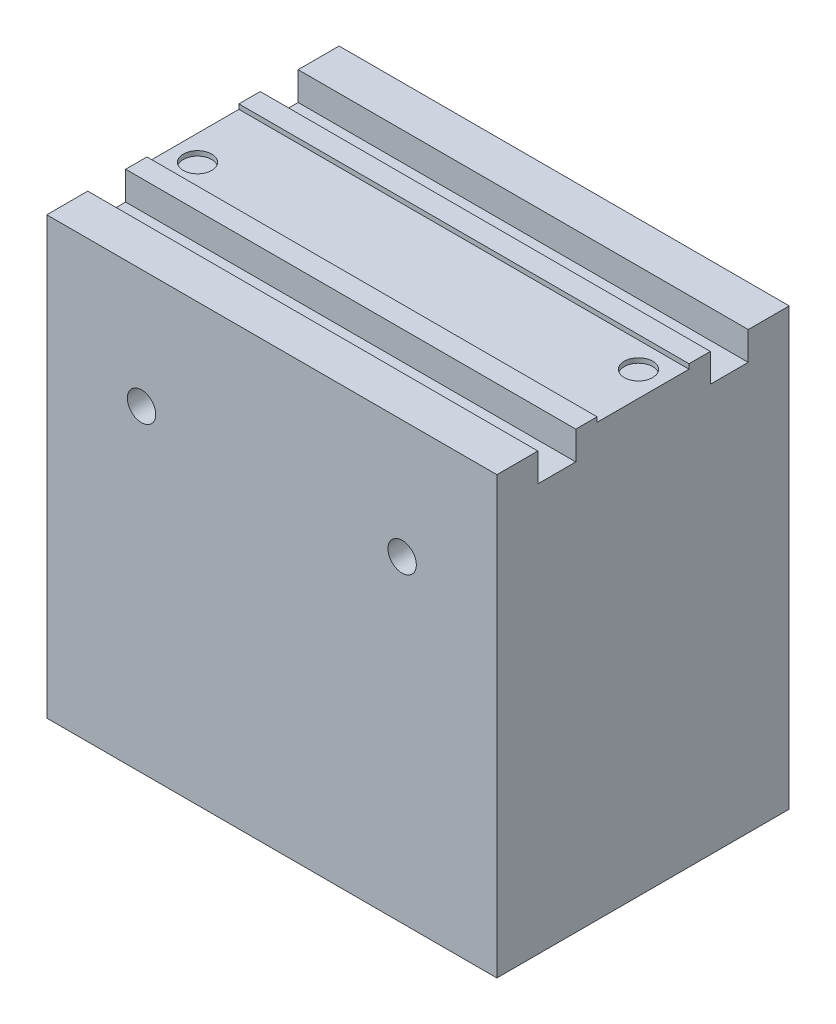
ISO-10303-21;
HEADER;
FILE_DESCRIPTION(('STEP AP214'),'2;1');
FILE_NAME('part.step','',(''),(''),'','','');
FILE_SCHEMA(('AUTOMOTIVE_DESIGN { 1 0 10303 214 1 1 1 1 }'));
ENDSEC;
DATA;
#1=APPLICATION_CONTEXT('core data for automotive mechanical design processes');
#2=APPLICATION_PROTOCOL_DEFINITION('international standard','automotive_design',2000,#1);
#3=PRODUCT_CONTEXT('',#1,'mechanical');
#4=PRODUCT('Part','Part','',(#3));
#5=PRODUCT_RELATED_PRODUCT_CATEGORY('part','',(#4));
#6=PRODUCT_DEFINITION_FORMATION('','',#4);
#7=PRODUCT_DEFINITION_CONTEXT('part definition',#1,'design');
#8=PRODUCT_DEFINITION('design','',#6,#7);
#9=PRODUCT_DEFINITION_SHAPE('','',#8);
#10=(LENGTH_UNIT() NAMED_UNIT(*) SI_UNIT(.MILLI.,.METRE.));
#11=(NAMED_UNIT(*) PLANE_ANGLE_UNIT() SI_UNIT($,.RADIAN.));
#12=(NAMED_UNIT(*) SI_UNIT($,.STERADIAN.) SOLID_ANGLE_UNIT());
#13=UNCERTAINTY_MEASURE_WITH_UNIT(LENGTH_MEASURE(1.E-05),#10,'distance_accuracy_value','');
#14=(GEOMETRIC_REPRESENTATION_CONTEXT(3) GLOBAL_UNCERTAINTY_ASSIGNED_CONTEXT((#13)) GLOBAL_UNIT_ASSIGNED_CONTEXT((#10,
#11,#12)) REPRESENTATION_CONTEXT('',''));
#15=CARTESIAN_POINT('',(0.,0.,0.));
#16=DIRECTION('',(0.,0.,1.));
#17=DIRECTION('',(1.,0.,0.));
#18=AXIS2_PLACEMENT_3D('',#15,#16,#17);
#19=CARTESIAN_POINT('',(0.,92.,0.));
#20=DIRECTION('',(0.,1.,0.));
#21=DIRECTION('',(0.,0.,1.));
#22=AXIS2_PLACEMENT_3D('',#19,#20,#21);
#23=PLANE('',#22);
#24=DIRECTION('',(-1.,0.,0.));
#25=VECTOR('',#24,1.);
#26=CARTESIAN_POINT('',(-47.5,92.,-22.2));
#27=LINE('',#26,#25);
#28=CARTESIAN_POINT('',(47.5,92.,-22.2));
#29=VERTEX_POINT('',#28);
#30=CARTESIAN_POINT('',(-47.5,92.,-22.2));
#31=VERTEX_POINT('',#30);
#32=EDGE_CURVE('E215',#29,#31,#27,.T.);
#33=ORIENTED_EDGE('',*,*,#32,.F.);
#34=DIRECTION('',(0.,0.,-1.));
#35=VECTOR('',#34,1.);
#36=CARTESIAN_POINT('',(47.5,92.,30.85));
#37=LINE('',#36,#35);
#38=CARTESIAN_POINT('',(47.5,92.,-30.85));
#39=VERTEX_POINT('',#38);
#40=EDGE_CURVE('E250',#29,#39,#37,.T.);
#41=ORIENTED_EDGE('',*,*,#40,.T.);
#42=DIRECTION('',(-1.,0.,0.));
#43=VECTOR('',#42,1.);
#44=CARTESIAN_POINT('',(-47.5,92.,-30.85));
#45=LINE('',#44,#43);
#46=CARTESIAN_POINT('',(-47.5,92.,-30.85));
#47=VERTEX_POINT('',#46);
#48=EDGE_CURVE('E252',#39,#47,#45,.T.);
#49=ORIENTED_EDGE('',*,*,#48,.T.);
#50=DIRECTION('',(0.,0.,1.));
#51=VECTOR('',#50,1.);
#52=CARTESIAN_POINT('',(-47.5,92.,30.85));
#53=LINE('',#52,#51);
#54=EDGE_CURVE('E246',#47,#31,#53,.T.);
#55=ORIENTED_EDGE('',*,*,#54,.T.);
#56=EDGE_LOOP('',(#33,#41,#49,#55));
#57=FACE_BOUND('',#56,.T.);
#58=ADVANCED_FACE('F36',(#57),#23,.T.);
#59=DIRECTION('',(-1.,0.,0.));
#60=VECTOR('',#59,1.);
#61=CARTESIAN_POINT('',(-47.5,92.,14.2));
#62=LINE('',#61,#60);
#63=CARTESIAN_POINT('',(47.5,92.,14.2));
#64=VERTEX_POINT('',#63);
#65=CARTESIAN_POINT('',(-47.5,92.,14.2));
#66=VERTEX_POINT('',#65);
#67=EDGE_CURVE('E190',#64,#66,#62,.T.);
#68=ORIENTED_EDGE('',*,*,#67,.F.);
#69=CARTESIAN_POINT('',(47.5,92.,9.7));
#70=VERTEX_POINT('',#69);
#71=EDGE_CURVE('E244',#64,#70,#37,.T.);
#72=ORIENTED_EDGE('',*,*,#71,.T.);
#73=DIRECTION('',(1.,0.,0.));
#74=VECTOR('',#73,1.);
#75=CARTESIAN_POINT('',(-47.5,92.,9.7));
#76=LINE('',#75,#74);
#77=CARTESIAN_POINT('',(-47.5,92.,9.7));
#78=VERTEX_POINT('',#77);
#79=EDGE_CURVE('E240',#78,#70,#76,.T.);
#80=ORIENTED_EDGE('',*,*,#79,.F.);
#81=EDGE_CURVE('E175',#78,#66,#53,.T.);
#82=ORIENTED_EDGE('',*,*,#81,.T.);
#83=EDGE_LOOP('',(#68,#72,#80,#82));
#84=FACE_BOUND('',#83,.T.);
#85=ADVANCED_FACE('F371',(#84),#23,.T.);
#86=CARTESIAN_POINT('',(47.5,93.,30.85));
#87=DIRECTION('',(-1.,0.,0.));
#88=DIRECTION('',(0.,0.,1.));
#89=AXIS2_PLACEMENT_3D('',#86,#87,#88);
#90=PLANE('',#89);
#91=CARTESIAN_POINT('',(47.5,92.,-9.7));
#92=VERTEX_POINT('',#91);
#93=CARTESIAN_POINT('',(47.5,92.,-14.2));
#94=VERTEX_POINT('',#93);
#95=EDGE_CURVE('E251',#92,#94,#37,.T.);
#96=ORIENTED_EDGE('',*,*,#95,.F.);
#97=DIRECTION('',(0.,1.,0.));
#98=VECTOR('',#97,1.);
#99=CARTESIAN_POINT('',(47.5,91.,-9.7));
#100=LINE('',#99,#98);
#101=CARTESIAN_POINT('',(47.5,91.,-9.7));
#102=VERTEX_POINT('',#101);
#103=EDGE_CURVE('E177',#102,#92,#100,.T.);
#104=ORIENTED_EDGE('',*,*,#103,.F.);
#105=DIRECTION('',(0.,0.,-1.));
#106=VECTOR('',#105,1.);
#107=CARTESIAN_POINT('',(47.5,91.,9.7));
#108=LINE('',#107,#106);
#109=CARTESIAN_POINT('',(47.5,91.,9.7));
#110=VERTEX_POINT('',#109);
#111=EDGE_CURVE('E158',#110,#102,#108,.T.);
#112=ORIENTED_EDGE('',*,*,#111,.F.);
#113=DIRECTION('',(0.,1.,0.));
#114=VECTOR('',#113,1.);
#115=CARTESIAN_POINT('',(47.5,91.,9.7));
#116=LINE('',#115,#114);
#117=EDGE_CURVE('E155',#110,#70,#116,.T.);
#118=ORIENTED_EDGE('',*,*,#117,.T.);
#119=ORIENTED_EDGE('',*,*,#71,.F.);
#120=DIRECTION('',(0.,1.,0.));
#121=VECTOR('',#120,1.);
#122=CARTESIAN_POINT('',(47.5,86.,14.2));
#123=LINE('',#122,#121);
#124=CARTESIAN_POINT('',(47.5,86.,14.2));
#125=VERTEX_POINT('',#124);
#126=EDGE_CURVE('E205',#125,#64,#123,.T.);
#127=ORIENTED_EDGE('',*,*,#126,.F.);
#128=DIRECTION('',(0.,0.,-1.));
#129=VECTOR('',#128,1.);
#130=CARTESIAN_POINT('',(47.5,86.,22.2));
#131=LINE('',#130,#129);
#132=CARTESIAN_POINT('',(47.5,86.,22.2));
#133=VERTEX_POINT('',#132);
#134=EDGE_CURVE('E193',#133,#125,#131,.T.);
#135=ORIENTED_EDGE('',*,*,#134,.F.);
#136=DIRECTION('',(0.,1.,0.));
#137=VECTOR('',#136,1.);
#138=CARTESIAN_POINT('',(47.5,86.,22.2));
#139=LINE('',#138,#137);
#140=CARTESIAN_POINT('',(47.5,92.,22.2));
#141=VERTEX_POINT('',#140);
#142=EDGE_CURVE('E207',#133,#141,#139,.T.);
#143=ORIENTED_EDGE('',*,*,#142,.T.);
#144=CARTESIAN_POINT('',(47.5,92.,30.85));
#145=VERTEX_POINT('',#144);
#146=EDGE_CURVE('E247',#145,#141,#37,.T.);
#147=ORIENTED_EDGE('',*,*,#146,.F.);
#148=DIRECTION('',(0.,-1.,0.));
#149=VECTOR('',#148,1.);
#150=CARTESIAN_POINT('',(47.5,93.,30.85));
#151=LINE('',#150,#149);
#152=CARTESIAN_POINT('',(47.5,0.,30.85));
#153=VERTEX_POINT('',#152);
#154=EDGE_CURVE('E266',#145,#153,#151,.T.);
#155=ORIENTED_EDGE('',*,*,#154,.T.);
#156=DIRECTION('',(0.,0.,-1.));
#157=VECTOR('',#156,1.);
#158=CARTESIAN_POINT('',(47.5,0.,30.85));
#159=LINE('',#158,#157);
#160=CARTESIAN_POINT('',(47.5,0.,-30.85));
#161=VERTEX_POINT('',#160);
#162=EDGE_CURVE('E254',#153,#161,#159,.T.);
#163=ORIENTED_EDGE('',*,*,#162,.T.);
#164=DIRECTION('',(0.,-1.,0.));
#165=VECTOR('',#164,1.);
#166=CARTESIAN_POINT('',(47.5,93.,-30.85));
#167=LINE('',#166,#165);
#168=EDGE_CURVE('E45',#39,#161,#167,.T.);
#169=ORIENTED_EDGE('',*,*,#168,.F.);
#170=ORIENTED_EDGE('',*,*,#40,.F.);
#171=DIRECTION('',(0.,1.,0.));
#172=VECTOR('',#171,1.);
#173=CARTESIAN_POINT('',(47.5,86.,-22.2));
#174=LINE('',#173,#172);
#175=CARTESIAN_POINT('',(47.5,86.,-22.2));
#176=VERTEX_POINT('',#175);
#177=EDGE_CURVE('E227',#176,#29,#174,.T.);
#178=ORIENTED_EDGE('',*,*,#177,.F.);
#179=DIRECTION('',(0.,0.,-1.));
#180=VECTOR('',#179,1.);
#181=CARTESIAN_POINT('',(47.5,86.,-22.2));
#182=LINE('',#181,#180);
#183=CARTESIAN_POINT('',(47.5,86.,-14.2));
#184=VERTEX_POINT('',#183);
#185=EDGE_CURVE('E218',#184,#176,#182,.T.);
#186=ORIENTED_EDGE('',*,*,#185,.F.);
#187=DIRECTION('',(0.,1.,0.));
#188=VECTOR('',#187,1.);
#189=CARTESIAN_POINT('',(47.5,86.,-14.2));
#190=LINE('',#189,#188);
#191=EDGE_CURVE('E229',#184,#94,#190,.T.);
#192=ORIENTED_EDGE('',*,*,#191,.T.);
#193=EDGE_LOOP('',(#96,#104,#112,#118,#119,#127,#135,#143,#147,#155,#163,#169,#170,#178,#186,#192));
#194=FACE_BOUND('',#193,.T.);
#195=ADVANCED_FACE('F38',(#194),#90,.F.);
#196=CARTESIAN_POINT('',(-47.5,93.,-30.85));
#197=DIRECTION('',(0.,0.,1.));
#198=DIRECTION('',(1.,0.,0.));
#199=AXIS2_PLACEMENT_3D('',#196,#197,#198);
#200=PLANE('',#199);
#201=CARTESIAN_POINT('',(-27.5,66.9999999999999,-30.85));
#202=DIRECTION('',(0.,0.,1.));
#203=DIRECTION('',(1.,0.,0.));
#204=AXIS2_PLACEMENT_3D('',#201,#202,#203);
#205=CIRCLE('',#204,3.);
#206=CARTESIAN_POINT('',(-24.5,66.9999999999999,-30.85));
#207=VERTEX_POINT('',#206);
#208=EDGE_CURVE('E169',#207,#207,#205,.T.);
#209=ORIENTED_EDGE('',*,*,#208,.T.);
#210=EDGE_LOOP('',(#209));
#211=FACE_BOUND('',#210,.T.);
#212=CARTESIAN_POINT('',(27.5,66.9999999999999,-30.85));
#213=DIRECTION('',(0.,0.,1.));
#214=DIRECTION('',(-1.,0.,0.));
#215=AXIS2_PLACEMENT_3D('',#212,#213,#214);
#216=CIRCLE('',#215,3.00000000000001);
#217=CARTESIAN_POINT('',(24.5,66.9999999999999,-30.85));
#218=VERTEX_POINT('',#217);
#219=EDGE_CURVE('E335',#218,#218,#216,.T.);
#220=ORIENTED_EDGE('',*,*,#219,.T.);
#221=EDGE_LOOP('',(#220));
#222=FACE_BOUND('',#221,.T.);
#223=ORIENTED_EDGE('',*,*,#48,.F.);
#224=ORIENTED_EDGE('',*,*,#168,.T.);
#225=DIRECTION('',(-1.,0.,0.));
#226=VECTOR('',#225,1.);
#227=CARTESIAN_POINT('',(-47.5,0.,-30.85));
#228=LINE('',#227,#226);
#229=CARTESIAN_POINT('',(-47.5,0.,-30.85));
#230=VERTEX_POINT('',#229);
#231=EDGE_CURVE('E257',#161,#230,#228,.T.);
#232=ORIENTED_EDGE('',*,*,#231,.T.);
#233=DIRECTION('',(0.,-1.,0.));
#234=VECTOR('',#233,1.);
#235=CARTESIAN_POINT('',(-47.5,93.,-30.85));
#236=LINE('',#235,#234);
#237=EDGE_CURVE('E270',#47,#230,#236,.T.);
#238=ORIENTED_EDGE('',*,*,#237,.F.);
#239=EDGE_LOOP('',(#223,#224,#232,#238));
#240=FACE_BOUND('',#239,.T.);
#241=ADVANCED_FACE('F276',(#211,#222,#240),#200,.F.);
#242=CARTESIAN_POINT('',(-47.5,93.,30.85));
#243=DIRECTION('',(1.,0.,0.));
#244=DIRECTION('',(0.,0.,-1.));
#245=AXIS2_PLACEMENT_3D('',#242,#243,#244);
#246=PLANE('',#245);
#247=DIRECTION('',(0.,0.,1.));
#248=VECTOR('',#247,1.);
#249=CARTESIAN_POINT('',(-47.5,91.,-9.7));
#250=LINE('',#249,#248);
#251=CARTESIAN_POINT('',(-47.5,91.,-9.7));
#252=VERTEX_POINT('',#251);
#253=CARTESIAN_POINT('',(-47.5,91.,9.7));
#254=VERTEX_POINT('',#253);
#255=EDGE_CURVE('E159',#252,#254,#250,.T.);
#256=ORIENTED_EDGE('',*,*,#255,.F.);
#257=DIRECTION('',(0.,1.,0.));
#258=VECTOR('',#257,1.);
#259=CARTESIAN_POINT('',(-47.5,91.,-9.7));
#260=LINE('',#259,#258);
#261=CARTESIAN_POINT('',(-47.5,92.,-9.7));
#262=VERTEX_POINT('',#261);
#263=EDGE_CURVE('E322',#252,#262,#260,.T.);
#264=ORIENTED_EDGE('',*,*,#263,.T.);
#265=CARTESIAN_POINT('',(-47.5,92.,-14.2));
#266=VERTEX_POINT('',#265);
#267=EDGE_CURVE('E245',#266,#262,#53,.T.);
#268=ORIENTED_EDGE('',*,*,#267,.F.);
#269=DIRECTION('',(0.,1.,0.));
#270=VECTOR('',#269,1.);
#271=CARTESIAN_POINT('',(-47.5,86.,-14.2));
#272=LINE('',#271,#270);
#273=CARTESIAN_POINT('',(-47.5,86.,-14.2));
#274=VERTEX_POINT('',#273);
#275=EDGE_CURVE('E52',#274,#266,#272,.T.);
#276=ORIENTED_EDGE('',*,*,#275,.F.);
#277=DIRECTION('',(0.,0.,1.));
#278=VECTOR('',#277,1.);
#279=CARTESIAN_POINT('',(-47.5,86.,-22.2));
#280=LINE('',#279,#278);
#281=CARTESIAN_POINT('',(-47.5,86.,-22.2));
#282=VERTEX_POINT('',#281);
#283=EDGE_CURVE('E211',#282,#274,#280,.T.);
#284=ORIENTED_EDGE('',*,*,#283,.F.);
#285=DIRECTION('',(0.,1.,0.));
#286=VECTOR('',#285,1.);
#287=CARTESIAN_POINT('',(-47.5,86.,-22.2));
#288=LINE('',#287,#286);
#289=EDGE_CURVE('E200',#282,#31,#288,.T.);
#290=ORIENTED_EDGE('',*,*,#289,.T.);
#291=ORIENTED_EDGE('',*,*,#54,.F.);
#292=ORIENTED_EDGE('',*,*,#237,.T.);
#293=DIRECTION('',(0.,0.,1.));
#294=VECTOR('',#293,1.);
#295=CARTESIAN_POINT('',(-47.5,0.,30.85));
#296=LINE('',#295,#294);
#297=CARTESIAN_POINT('',(-47.5,0.,30.85));
#298=VERTEX_POINT('',#297);
#299=EDGE_CURVE('E260',#230,#298,#296,.T.);
#300=ORIENTED_EDGE('',*,*,#299,.T.);
#301=DIRECTION('',(0.,-1.,0.));
#302=VECTOR('',#301,1.);
#303=CARTESIAN_POINT('',(-47.5,93.,30.85));
#304=LINE('',#303,#302);
#305=CARTESIAN_POINT('',(-47.5,92.,30.85));
#306=VERTEX_POINT('',#305);
#307=EDGE_CURVE('E268',#306,#298,#304,.T.);
#308=ORIENTED_EDGE('',*,*,#307,.F.);
#309=CARTESIAN_POINT('',(-47.5,92.,22.2));
#310=VERTEX_POINT('',#309);
#311=EDGE_CURVE('E242',#310,#306,#53,.T.);
#312=ORIENTED_EDGE('',*,*,#311,.F.);
#313=DIRECTION('',(0.,1.,0.));
#314=VECTOR('',#313,1.);
#315=CARTESIAN_POINT('',(-47.5,86.,22.2));
#316=LINE('',#315,#314);
#317=CARTESIAN_POINT('',(-47.5,86.,22.2));
#318=VERTEX_POINT('',#317);
#319=EDGE_CURVE('E60',#318,#310,#316,.T.);
#320=ORIENTED_EDGE('',*,*,#319,.F.);
#321=DIRECTION('',(0.,0.,1.));
#322=VECTOR('',#321,1.);
#323=CARTESIAN_POINT('',(-47.5,86.,22.2));
#324=LINE('',#323,#322);
#325=CARTESIAN_POINT('',(-47.5,86.,14.2));
#326=VERTEX_POINT('',#325);
#327=EDGE_CURVE('E186',#326,#318,#324,.T.);
#328=ORIENTED_EDGE('',*,*,#327,.F.);
#329=DIRECTION('',(0.,1.,0.));
#330=VECTOR('',#329,1.);
#331=CARTESIAN_POINT('',(-47.5,86.,14.2));
#332=LINE('',#331,#330);
#333=EDGE_CURVE('E202',#326,#66,#332,.T.);
#334=ORIENTED_EDGE('',*,*,#333,.T.);
#335=ORIENTED_EDGE('',*,*,#81,.F.);
#336=DIRECTION('',(0.,1.,0.));
#337=VECTOR('',#336,1.);
#338=CARTESIAN_POINT('',(-47.5,91.,9.7));
#339=LINE('',#338,#337);
#340=EDGE_CURVE('E152',#254,#78,#339,.T.);
#341=ORIENTED_EDGE('',*,*,#340,.F.);
#342=EDGE_LOOP('',(#256,#264,#268,#276,#284,#290,#291,#292,#300,#308,#312,#320,#328,#334,#335,#341));
#343=FACE_BOUND('',#342,.T.);
#344=ADVANCED_FACE('F172',(#343),#246,.F.);
#345=CARTESIAN_POINT('',(-47.5,93.,30.85));
#346=DIRECTION('',(0.,0.,-1.));
#347=DIRECTION('',(-1.,0.,0.));
#348=AXIS2_PLACEMENT_3D('',#345,#346,#347);
#349=PLANE('',#348);
#350=CARTESIAN_POINT('',(-27.5,66.9999999999999,30.85));
#351=DIRECTION('',(0.,0.,1.));
#352=DIRECTION('',(1.,0.,0.));
#353=AXIS2_PLACEMENT_3D('',#350,#351,#352);
#354=CIRCLE('',#353,3.);
#355=CARTESIAN_POINT('',(-24.5,66.9999999999999,30.85));
#356=VERTEX_POINT('',#355);
#357=EDGE_CURVE('E338',#356,#356,#354,.T.);
#358=ORIENTED_EDGE('',*,*,#357,.F.);
#359=EDGE_LOOP('',(#358));
#360=FACE_BOUND('',#359,.T.);
#361=CARTESIAN_POINT('',(27.5,66.9999999999999,30.85));
#362=DIRECTION('',(0.,0.,1.));
#363=DIRECTION('',(-1.,0.,0.));
#364=AXIS2_PLACEMENT_3D('',#361,#362,#363);
#365=CIRCLE('',#364,3.00000000000001);
#366=CARTESIAN_POINT('',(24.5,66.9999999999999,30.85));
#367=VERTEX_POINT('',#366);
#368=EDGE_CURVE('E332',#367,#367,#365,.T.);
#369=ORIENTED_EDGE('',*,*,#368,.F.);
#370=EDGE_LOOP('',(#369));
#371=FACE_BOUND('',#370,.T.);
#372=DIRECTION('',(1.,0.,0.));
#373=VECTOR('',#372,1.);
#374=CARTESIAN_POINT('',(-47.5,92.,30.85));
#375=LINE('',#374,#373);
#376=EDGE_CURVE('E12',#306,#145,#375,.T.);
#377=ORIENTED_EDGE('',*,*,#376,.F.);
#378=ORIENTED_EDGE('',*,*,#307,.T.);
#379=DIRECTION('',(1.,0.,0.));
#380=VECTOR('',#379,1.);
#381=CARTESIAN_POINT('',(-47.5,0.,30.85));
#382=LINE('',#381,#380);
#383=EDGE_CURVE('E263',#298,#153,#382,.T.);
#384=ORIENTED_EDGE('',*,*,#383,.T.);
#385=ORIENTED_EDGE('',*,*,#154,.F.);
#386=EDGE_LOOP('',(#377,#378,#384,#385));
#387=FACE_BOUND('',#386,.T.);
#388=ADVANCED_FACE('F290',(#360,#371,#387),#349,.F.);
#389=CARTESIAN_POINT('',(0.,0.,0.));
#390=DIRECTION('',(0.,-1.,0.));
#391=DIRECTION('',(0.,0.,-1.));
#392=AXIS2_PLACEMENT_3D('',#389,#390,#391);
#393=PLANE('',#392);
#394=ORIENTED_EDGE('',*,*,#162,.F.);
#395=ORIENTED_EDGE('',*,*,#383,.F.);
#396=ORIENTED_EDGE('',*,*,#299,.F.);
#397=ORIENTED_EDGE('',*,*,#231,.F.);
#398=EDGE_LOOP('',(#394,#395,#396,#397));
#399=FACE_BOUND('',#398,.T.);
#400=ADVANCED_FACE('F283',(#399),#393,.T.);
#401=DIRECTION('',(1.,0.,0.));
#402=VECTOR('',#401,1.);
#403=CARTESIAN_POINT('',(-47.5,92.,-14.2));
#404=LINE('',#403,#402);
#405=EDGE_CURVE('E185',#266,#94,#404,.T.);
#406=ORIENTED_EDGE('',*,*,#405,.F.);
#407=ORIENTED_EDGE('',*,*,#267,.T.);
#408=DIRECTION('',(-1.,0.,0.));
#409=VECTOR('',#408,1.);
#410=CARTESIAN_POINT('',(-47.5,92.,-9.7));
#411=LINE('',#410,#409);
#412=EDGE_CURVE('E236',#92,#262,#411,.T.);
#413=ORIENTED_EDGE('',*,*,#412,.F.);
#414=ORIENTED_EDGE('',*,*,#95,.T.);
#415=EDGE_LOOP('',(#406,#407,#413,#414));
#416=FACE_BOUND('',#415,.T.);
#417=ADVANCED_FACE('F325',(#416),#23,.T.);
#418=DIRECTION('',(1.,0.,0.));
#419=VECTOR('',#418,1.);
#420=CARTESIAN_POINT('',(-47.5,92.,22.2));
#421=LINE('',#420,#419);
#422=EDGE_CURVE('E198',#310,#141,#421,.T.);
#423=ORIENTED_EDGE('',*,*,#422,.F.);
#424=ORIENTED_EDGE('',*,*,#311,.T.);
#425=ORIENTED_EDGE('',*,*,#376,.T.);
#426=ORIENTED_EDGE('',*,*,#146,.T.);
#427=EDGE_LOOP('',(#423,#424,#425,#426));
#428=FACE_BOUND('',#427,.T.);
#429=ADVANCED_FACE('F300',(#428),#23,.T.);
#430=CARTESIAN_POINT('',(-47.5,86.,14.2));
#431=DIRECTION('',(0.,0.,-1.));
#432=DIRECTION('',(-1.,0.,0.));
#433=AXIS2_PLACEMENT_3D('',#430,#431,#432);
#434=PLANE('',#433);
#435=ORIENTED_EDGE('',*,*,#67,.T.);
#436=ORIENTED_EDGE('',*,*,#333,.F.);
#437=DIRECTION('',(-1.,0.,0.));
#438=VECTOR('',#437,1.);
#439=CARTESIAN_POINT('',(-47.5,86.,14.2));
#440=LINE('',#439,#438);
#441=EDGE_CURVE('E195',#125,#326,#440,.T.);
#442=ORIENTED_EDGE('',*,*,#441,.F.);
#443=ORIENTED_EDGE('',*,*,#126,.T.);
#444=EDGE_LOOP('',(#435,#436,#442,#443));
#445=FACE_BOUND('',#444,.T.);
#446=ADVANCED_FACE('F308',(#445),#434,.F.);
#447=CARTESIAN_POINT('',(-47.5,86.,22.2));
#448=DIRECTION('',(0.,0.,1.));
#449=DIRECTION('',(1.,0.,0.));
#450=AXIS2_PLACEMENT_3D('',#447,#448,#449);
#451=PLANE('',#450);
#452=ORIENTED_EDGE('',*,*,#422,.T.);
#453=ORIENTED_EDGE('',*,*,#142,.F.);
#454=DIRECTION('',(1.,0.,0.));
#455=VECTOR('',#454,1.);
#456=CARTESIAN_POINT('',(-47.5,86.,22.2));
#457=LINE('',#456,#455);
#458=EDGE_CURVE('E189',#318,#133,#457,.T.);
#459=ORIENTED_EDGE('',*,*,#458,.F.);
#460=ORIENTED_EDGE('',*,*,#319,.T.);
#461=EDGE_LOOP('',(#452,#453,#459,#460));
#462=FACE_BOUND('',#461,.T.);
#463=ADVANCED_FACE('F435',(#462),#451,.F.);
#464=CARTESIAN_POINT('',(0.,86.,0.));
#465=DIRECTION('',(0.,-1.,0.));
#466=DIRECTION('',(0.,0.,-1.));
#467=AXIS2_PLACEMENT_3D('',#464,#465,#466);
#468=PLANE('',#467);
#469=ORIENTED_EDGE('',*,*,#327,.T.);
#470=ORIENTED_EDGE('',*,*,#458,.T.);
#471=ORIENTED_EDGE('',*,*,#134,.T.);
#472=ORIENTED_EDGE('',*,*,#441,.T.);
#473=EDGE_LOOP('',(#469,#470,#471,#472));
#474=FACE_BOUND('',#473,.T.);
#475=ADVANCED_FACE('F303',(#474),#468,.F.);
#476=CARTESIAN_POINT('',(-47.5,86.,-22.2));
#477=DIRECTION('',(0.,0.,-1.));
#478=DIRECTION('',(-1.,0.,0.));
#479=AXIS2_PLACEMENT_3D('',#476,#477,#478);
#480=PLANE('',#479);
#481=ORIENTED_EDGE('',*,*,#32,.T.);
#482=ORIENTED_EDGE('',*,*,#289,.F.);
#483=DIRECTION('',(-1.,0.,0.));
#484=VECTOR('',#483,1.);
#485=CARTESIAN_POINT('',(-47.5,86.,-22.2));
#486=LINE('',#485,#484);
#487=EDGE_CURVE('E220',#176,#282,#486,.T.);
#488=ORIENTED_EDGE('',*,*,#487,.F.);
#489=ORIENTED_EDGE('',*,*,#177,.T.);
#490=EDGE_LOOP('',(#481,#482,#488,#489));
#491=FACE_BOUND('',#490,.T.);
#492=ADVANCED_FACE('F318',(#491),#480,.F.);
#493=CARTESIAN_POINT('',(-47.5,86.,-14.2));
#494=DIRECTION('',(0.,0.,1.));
#495=DIRECTION('',(1.,0.,0.));
#496=AXIS2_PLACEMENT_3D('',#493,#494,#495);
#497=PLANE('',#496);
#498=ORIENTED_EDGE('',*,*,#405,.T.);
#499=ORIENTED_EDGE('',*,*,#191,.F.);
#500=DIRECTION('',(1.,0.,0.));
#501=VECTOR('',#500,1.);
#502=CARTESIAN_POINT('',(-47.5,86.,-14.2));
#503=LINE('',#502,#501);
#504=EDGE_CURVE('E214',#274,#184,#503,.T.);
#505=ORIENTED_EDGE('',*,*,#504,.F.);
#506=ORIENTED_EDGE('',*,*,#275,.T.);
#507=EDGE_LOOP('',(#498,#499,#505,#506));
#508=FACE_BOUND('',#507,.T.);
#509=ADVANCED_FACE('F326',(#508),#497,.F.);
#510=CARTESIAN_POINT('',(0.,86.,0.));
#511=DIRECTION('',(0.,1.,0.));
#512=DIRECTION('',(0.,0.,1.));
#513=AXIS2_PLACEMENT_3D('',#510,#511,#512);
#514=PLANE('',#513);
#515=ORIENTED_EDGE('',*,*,#283,.T.);
#516=ORIENTED_EDGE('',*,*,#504,.T.);
#517=ORIENTED_EDGE('',*,*,#185,.T.);
#518=ORIENTED_EDGE('',*,*,#487,.T.);
#519=EDGE_LOOP('',(#515,#516,#517,#518));
#520=FACE_BOUND('',#519,.T.);
#521=ADVANCED_FACE('F320',(#520),#514,.T.);
#522=CARTESIAN_POINT('',(0.,91.,0.));
#523=DIRECTION('',(0.,1.,0.));
#524=DIRECTION('',(0.,0.,1.));
#525=AXIS2_PLACEMENT_3D('',#522,#523,#524);
#526=PLANE('',#525);
#527=ORIENTED_EDGE('',*,*,#255,.T.);
#528=DIRECTION('',(1.,0.,0.));
#529=VECTOR('',#528,1.);
#530=CARTESIAN_POINT('',(-47.5,91.,9.7));
#531=LINE('',#530,#529);
#532=EDGE_CURVE('E148',#254,#110,#531,.T.);
#533=ORIENTED_EDGE('',*,*,#532,.T.);
#534=ORIENTED_EDGE('',*,*,#111,.T.);
#535=DIRECTION('',(-1.,0.,0.));
#536=VECTOR('',#535,1.);
#537=CARTESIAN_POINT('',(47.5,91.,-9.7));
#538=LINE('',#537,#536);
#539=EDGE_CURVE('E166',#102,#252,#538,.T.);
#540=ORIENTED_EDGE('',*,*,#539,.T.);
#541=EDGE_LOOP('',(#527,#533,#534,#540));
#542=FACE_BOUND('',#541,.T.);
#543=CARTESIAN_POINT('',(-42.1960542705798,91.,4.33816465386666));
#544=DIRECTION('',(0.,1.,0.));
#545=DIRECTION('',(0.,0.,1.));
#546=AXIS2_PLACEMENT_3D('',#543,#544,#545);
#547=CIRCLE('',#546,3.);
#548=CARTESIAN_POINT('',(-42.1960542705798,91.,7.33816465386667));
#549=VERTEX_POINT('',#548);
#550=EDGE_CURVE('E40',#549,#549,#547,.F.);
#551=ORIENTED_EDGE('',*,*,#550,.T.);
#552=EDGE_LOOP('',(#551));
#553=FACE_BOUND('',#552,.T.);
#554=CARTESIAN_POINT('',(42.1960542705798,91.,-4.33816465386667));
#555=DIRECTION('',(0.,1.,0.));
#556=DIRECTION('',(0.,0.,1.));
#557=AXIS2_PLACEMENT_3D('',#554,#555,#556);
#558=CIRCLE('',#557,3.);
#559=CARTESIAN_POINT('',(42.1960542705798,91.,-1.33816465386666));
#560=VERTEX_POINT('',#559);
#561=EDGE_CURVE('E182',#560,#560,#558,.F.);
#562=ORIENTED_EDGE('',*,*,#561,.T.);
#563=EDGE_LOOP('',(#562));
#564=FACE_BOUND('',#563,.T.);
#565=ADVANCED_FACE('F163',(#542,#553,#564),#526,.T.);
#566=CARTESIAN_POINT('',(47.5,91.,-9.7));
#567=DIRECTION('',(0.,0.,-1.));
#568=DIRECTION('',(-1.,0.,0.));
#569=AXIS2_PLACEMENT_3D('',#566,#567,#568);
#570=PLANE('',#569);
#571=ORIENTED_EDGE('',*,*,#412,.T.);
#572=ORIENTED_EDGE('',*,*,#263,.F.);
#573=ORIENTED_EDGE('',*,*,#539,.F.);
#574=ORIENTED_EDGE('',*,*,#103,.T.);
#575=EDGE_LOOP('',(#571,#572,#573,#574));
#576=FACE_BOUND('',#575,.T.);
#577=ADVANCED_FACE('F513',(#576),#570,.F.);
#578=CARTESIAN_POINT('',(-47.5,91.,9.7));
#579=DIRECTION('',(0.,0.,1.));
#580=DIRECTION('',(1.,0.,0.));
#581=AXIS2_PLACEMENT_3D('',#578,#579,#580);
#582=PLANE('',#581);
#583=ORIENTED_EDGE('',*,*,#79,.T.);
#584=ORIENTED_EDGE('',*,*,#117,.F.);
#585=ORIENTED_EDGE('',*,*,#532,.F.);
#586=ORIENTED_EDGE('',*,*,#340,.T.);
#587=EDGE_LOOP('',(#583,#584,#585,#586));
#588=FACE_BOUND('',#587,.T.);
#589=ADVANCED_FACE('F150',(#588),#582,.F.);
#590=CARTESIAN_POINT('',(42.1960542705798,90.,-4.33816465386667));
#591=DIRECTION('',(0.,1.,0.));
#592=DIRECTION('',(0.,0.,1.));
#593=AXIS2_PLACEMENT_3D('',#590,#591,#592);
#594=PLANE('',#593);
#595=CARTESIAN_POINT('',(42.1960542705798,90.,-4.33816465386667));
#596=DIRECTION('',(0.,1.,0.));
#597=DIRECTION('',(0.,0.,1.));
#598=AXIS2_PLACEMENT_3D('',#595,#596,#597);
#599=CIRCLE('',#598,3.);
#600=CARTESIAN_POINT('',(42.1960542705798,90.,-1.33816465386666));
#601=VERTEX_POINT('',#600);
#602=EDGE_CURVE('E204',#601,#601,#599,.T.);
#603=ORIENTED_EDGE('',*,*,#602,.T.);
#604=EDGE_LOOP('',(#603));
#605=FACE_BOUND('',#604,.T.);
#606=ADVANCED_FACE('F477',(#605),#594,.T.);
#607=CARTESIAN_POINT('',(42.1960542705798,90.,-4.33816465386667));
#608=DIRECTION('',(0.,1.,0.));
#609=DIRECTION('',(0.,0.,1.));
#610=AXIS2_PLACEMENT_3D('',#607,#608,#609);
#611=CYLINDRICAL_SURFACE('',#610,3.);
#612=ORIENTED_EDGE('',*,*,#602,.F.);
#613=EDGE_LOOP('',(#612));
#614=FACE_BOUND('',#613,.T.);
#615=ORIENTED_EDGE('',*,*,#561,.F.);
#616=EDGE_LOOP('',(#615));
#617=FACE_BOUND('',#616,.T.);
#618=ADVANCED_FACE('F470',(#614,#617),#611,.F.);
#619=CARTESIAN_POINT('',(-42.1960542705798,90.,4.33816465386666));
#620=DIRECTION('',(0.,1.,0.));
#621=DIRECTION('',(0.,0.,1.));
#622=AXIS2_PLACEMENT_3D('',#619,#620,#621);
#623=PLANE('',#622);
#624=CARTESIAN_POINT('',(-42.1960542705798,90.,4.33816465386666));
#625=DIRECTION('',(0.,1.,0.));
#626=DIRECTION('',(0.,0.,1.));
#627=AXIS2_PLACEMENT_3D('',#624,#625,#626);
#628=CIRCLE('',#627,3.);
#629=CARTESIAN_POINT('',(-42.1960542705798,90.,7.33816465386667));
#630=VERTEX_POINT('',#629);
#631=EDGE_CURVE('E233',#630,#630,#628,.T.);
#632=ORIENTED_EDGE('',*,*,#631,.T.);
#633=EDGE_LOOP('',(#632));
#634=FACE_BOUND('',#633,.T.);
#635=ADVANCED_FACE('F365',(#634),#623,.T.);
#636=CARTESIAN_POINT('',(-42.1960542705798,90.,4.33816465386666));
#637=DIRECTION('',(0.,1.,0.));
#638=DIRECTION('',(0.,0.,1.));
#639=AXIS2_PLACEMENT_3D('',#636,#637,#638);
#640=CYLINDRICAL_SURFACE('',#639,3.);
#641=ORIENTED_EDGE('',*,*,#631,.F.);
#642=EDGE_LOOP('',(#641));
#643=FACE_BOUND('',#642,.T.);
#644=ORIENTED_EDGE('',*,*,#550,.F.);
#645=EDGE_LOOP('',(#644));
#646=FACE_BOUND('',#645,.T.);
#647=ADVANCED_FACE('F359',(#643,#646),#640,.F.);
#648=CARTESIAN_POINT('',(27.5,66.9999999999999,-30.85));
#649=DIRECTION('',(0.,0.,1.));
#650=DIRECTION('',(1.,0.,0.));
#651=AXIS2_PLACEMENT_3D('',#648,#649,#650);
#652=CYLINDRICAL_SURFACE('',#651,3.00000000000001);
#653=ORIENTED_EDGE('',*,*,#219,.F.);
#654=EDGE_LOOP('',(#653));
#655=FACE_BOUND('',#654,.T.);
#656=ORIENTED_EDGE('',*,*,#368,.T.);
#657=EDGE_LOOP('',(#656));
#658=FACE_BOUND('',#657,.T.);
#659=ADVANCED_FACE('F349',(#655,#658),#652,.F.);
#660=CARTESIAN_POINT('',(-27.5,66.9999999999999,-30.85));
#661=DIRECTION('',(0.,0.,1.));
#662=DIRECTION('',(1.,0.,0.));
#663=AXIS2_PLACEMENT_3D('',#660,#661,#662);
#664=CYLINDRICAL_SURFACE('',#663,3.);
#665=ORIENTED_EDGE('',*,*,#208,.F.);
#666=EDGE_LOOP('',(#665));
#667=FACE_BOUND('',#666,.T.);
#668=ORIENTED_EDGE('',*,*,#357,.T.);
#669=EDGE_LOOP('',(#668));
#670=FACE_BOUND('',#669,.T.);
#671=ADVANCED_FACE('F346',(#667,#670),#664,.F.);
#672=CLOSED_SHELL('',(#58,#85,#195,#241,#344,#388,#400,#417,#429,#446,#463,#475,#492,#509,#521,
#565,#577,#589,#606,#618,#635,#647,#659,#671));
#673=MANIFOLD_SOLID_BREP('B2',#672);
#674=ADVANCED_BREP_SHAPE_REPRESENTATION('',(#18,#673),#14);
#675=SHAPE_DEFINITION_REPRESENTATION(#9,#674);
ENDSEC;
END-ISO-10303-21;
